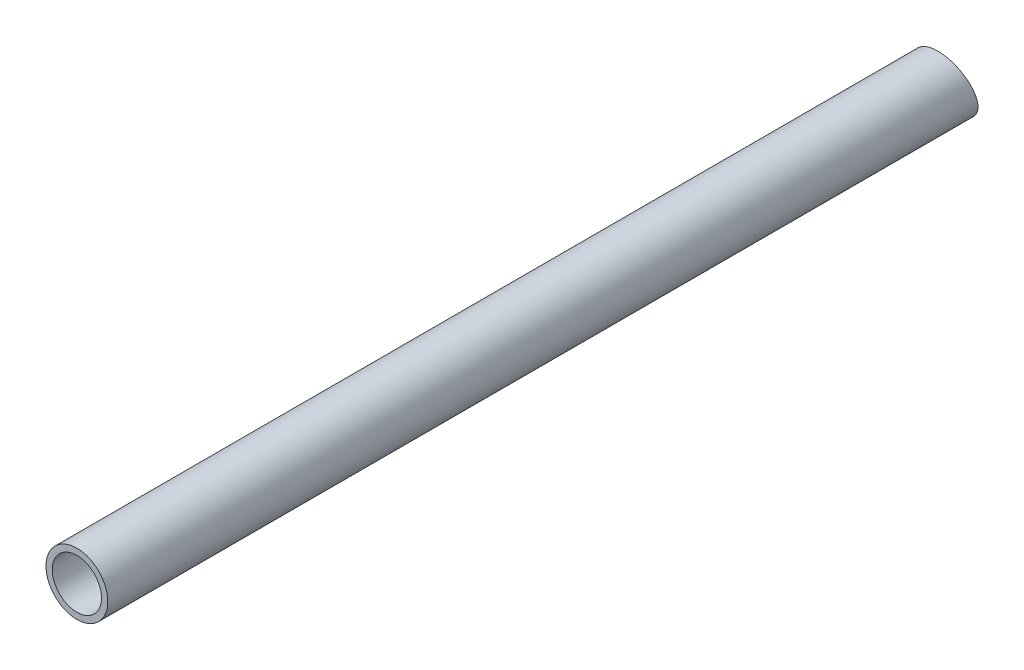
ISO-10303-21;
HEADER;
FILE_DESCRIPTION(('STEP AP214'),'2;1');
FILE_NAME('part.step','',(''),(''),'','','');
FILE_SCHEMA(('AUTOMOTIVE_DESIGN { 1 0 10303 214 1 1 1 1 }'));
ENDSEC;
DATA;
#1=APPLICATION_CONTEXT('core data for automotive mechanical design processes');
#2=APPLICATION_PROTOCOL_DEFINITION('international standard','automotive_design',2000,#1);
#3=PRODUCT_CONTEXT('',#1,'mechanical');
#4=PRODUCT('Part','Part','',(#3));
#5=PRODUCT_RELATED_PRODUCT_CATEGORY('part','',(#4));
#6=PRODUCT_DEFINITION_FORMATION('','',#4);
#7=PRODUCT_DEFINITION_CONTEXT('part definition',#1,'design');
#8=PRODUCT_DEFINITION('design','',#6,#7);
#9=PRODUCT_DEFINITION_SHAPE('','',#8);
#10=(LENGTH_UNIT() NAMED_UNIT(*) SI_UNIT(.MILLI.,.METRE.));
#11=(NAMED_UNIT(*) PLANE_ANGLE_UNIT() SI_UNIT($,.RADIAN.));
#12=(NAMED_UNIT(*) SI_UNIT($,.STERADIAN.) SOLID_ANGLE_UNIT());
#13=UNCERTAINTY_MEASURE_WITH_UNIT(LENGTH_MEASURE(1.E-05),#10,'distance_accuracy_value','');
#14=(GEOMETRIC_REPRESENTATION_CONTEXT(3) GLOBAL_UNCERTAINTY_ASSIGNED_CONTEXT((#13)) GLOBAL_UNIT_ASSIGNED_CONTEXT((#10,
#11,#12)) REPRESENTATION_CONTEXT('',''));
#15=CARTESIAN_POINT('',(0.,0.,0.));
#16=DIRECTION('',(0.,0.,1.));
#17=DIRECTION('',(1.,0.,0.));
#18=AXIS2_PLACEMENT_3D('',#15,#16,#17);
#19=CARTESIAN_POINT('',(0.,0.,0.));
#20=DIRECTION('',(0.,-0.258819045102515,0.96592582628907));
#21=DIRECTION('',(0.,-0.96592582628907,-0.258819045102515));
#22=AXIS2_PLACEMENT_3D('',#19,#20,#21);
#23=PLANE('',#22);
#24=CARTESIAN_POINT('',(0.,0.,0.));
#25=DIRECTION('',(0.,-0.258819045102515,0.96592582628907));
#26=DIRECTION('',(0.,-0.96592582628907,-0.258819045102515));
#27=AXIS2_PLACEMENT_3D('',#24,#25,#26);
#28=ELLIPSE('',#27,17.2896298509386,16.7005);
#29=CARTESIAN_POINT('',(0.,-16.7005,-4.47488548819585));
#30=VERTEX_POINT('',#29);
#31=EDGE_CURVE('E27',#30,#30,#28,.T.);
#32=ORIENTED_EDGE('',*,*,#31,.F.);
#33=EDGE_LOOP('',(#32));
#34=FACE_BOUND('',#33,.T.);
#35=CARTESIAN_POINT('',(0.,0.,0.));
#36=DIRECTION('',(0.,0.258819045102514,-0.96592582628907));
#37=DIRECTION('',(0.,-0.96592582628907,-0.258819045102514));
#38=AXIS2_PLACEMENT_3D('',#35,#36,#37);
#39=ELLIPSE('',#38,13.7922598582772,13.3223);
#40=CARTESIAN_POINT('',(0.,-13.3223,-3.56969952632504));
#41=VERTEX_POINT('',#40);
#42=EDGE_CURVE('E9',#41,#41,#39,.T.);
#43=ORIENTED_EDGE('',*,*,#42,.F.);
#44=EDGE_LOOP('',(#43));
#45=FACE_BOUND('',#44,.T.);
#46=ADVANCED_FACE('F14',(#34,#45),#23,.F.);
#47=CARTESIAN_POINT('',(0.,0.,0.));
#48=DIRECTION('',(0.,0.,1.));
#49=DIRECTION('',(1.,0.,0.));
#50=AXIS2_PLACEMENT_3D('',#47,#48,#49);
#51=CYLINDRICAL_SURFACE('',#50,13.3223);
#52=ORIENTED_EDGE('',*,*,#42,.T.);
#53=EDGE_LOOP('',(#52));
#54=FACE_BOUND('',#53,.T.);
#55=CARTESIAN_POINT('',(0.,0.,469.9));
#56=DIRECTION('',(0.,0.,1.));
#57=DIRECTION('',(1.,0.,0.));
#58=AXIS2_PLACEMENT_3D('',#55,#56,#57);
#59=CIRCLE('',#58,13.3223);
#60=CARTESIAN_POINT('',(13.3223,0.,469.9));
#61=VERTEX_POINT('',#60);
#62=EDGE_CURVE('E22',#61,#61,#59,.T.);
#63=ORIENTED_EDGE('',*,*,#62,.T.);
#64=EDGE_LOOP('',(#63));
#65=FACE_BOUND('',#64,.T.);
#66=ADVANCED_FACE('F42',(#54,#65),#51,.F.);
#67=CARTESIAN_POINT('',(0.,0.,0.));
#68=DIRECTION('',(0.,0.,1.));
#69=DIRECTION('',(1.,0.,0.));
#70=AXIS2_PLACEMENT_3D('',#67,#68,#69);
#71=CYLINDRICAL_SURFACE('',#70,16.7005);
#72=ORIENTED_EDGE('',*,*,#31,.T.);
#73=EDGE_LOOP('',(#72));
#74=FACE_BOUND('',#73,.T.);
#75=CARTESIAN_POINT('',(0.,0.,469.9));
#76=DIRECTION('',(0.,0.,-1.));
#77=DIRECTION('',(0.,-1.,0.));
#78=AXIS2_PLACEMENT_3D('',#75,#76,#77);
#79=CIRCLE('',#78,16.7005);
#80=CARTESIAN_POINT('',(0.,-16.7005,469.9));
#81=VERTEX_POINT('',#80);
#82=EDGE_CURVE('E18',#81,#81,#79,.T.);
#83=ORIENTED_EDGE('',*,*,#82,.T.);
#84=EDGE_LOOP('',(#83));
#85=FACE_BOUND('',#84,.T.);
#86=ADVANCED_FACE('F16',(#74,#85),#71,.T.);
#87=CARTESIAN_POINT('',(0.,0.,469.9));
#88=DIRECTION('',(0.,0.,1.));
#89=DIRECTION('',(1.,0.,0.));
#90=AXIS2_PLACEMENT_3D('',#87,#88,#89);
#91=PLANE('',#90);
#92=ORIENTED_EDGE('',*,*,#82,.F.);
#93=EDGE_LOOP('',(#92));
#94=FACE_BOUND('',#93,.T.);
#95=ORIENTED_EDGE('',*,*,#62,.F.);
#96=EDGE_LOOP('',(#95));
#97=FACE_BOUND('',#96,.T.);
#98=ADVANCED_FACE('F36',(#94,#97),#91,.T.);
#99=CLOSED_SHELL('',(#46,#66,#86,#98));
#100=MANIFOLD_SOLID_BREP('B1',#99);
#101=ADVANCED_BREP_SHAPE_REPRESENTATION('',(#18,#100),#14);
#102=SHAPE_DEFINITION_REPRESENTATION(#9,#101);
ENDSEC;
END-ISO-10303-21;
